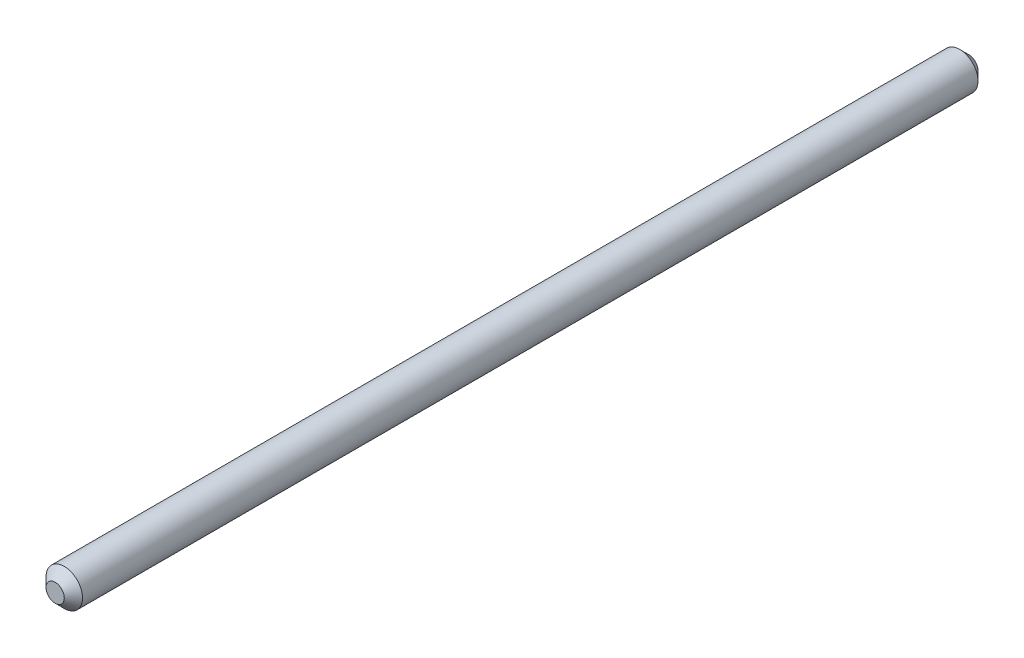
ISO-10303-21;
HEADER;
FILE_DESCRIPTION(('STEP AP214'),'2;1');
FILE_NAME('part.step','',(''),(''),'','','');
FILE_SCHEMA(('AUTOMOTIVE_DESIGN { 1 0 10303 214 1 1 1 1 }'));
ENDSEC;
DATA;
#1=APPLICATION_CONTEXT('core data for automotive mechanical design processes');
#2=APPLICATION_PROTOCOL_DEFINITION('international standard','automotive_design',2000,#1);
#3=PRODUCT_CONTEXT('',#1,'mechanical');
#4=PRODUCT('Part','Part','',(#3));
#5=PRODUCT_RELATED_PRODUCT_CATEGORY('part','',(#4));
#6=PRODUCT_DEFINITION_FORMATION('','',#4);
#7=PRODUCT_DEFINITION_CONTEXT('part definition',#1,'design');
#8=PRODUCT_DEFINITION('design','',#6,#7);
#9=PRODUCT_DEFINITION_SHAPE('','',#8);
#10=(LENGTH_UNIT() NAMED_UNIT(*) SI_UNIT(.MILLI.,.METRE.));
#11=(NAMED_UNIT(*) PLANE_ANGLE_UNIT() SI_UNIT($,.RADIAN.));
#12=(NAMED_UNIT(*) SI_UNIT($,.STERADIAN.) SOLID_ANGLE_UNIT());
#13=UNCERTAINTY_MEASURE_WITH_UNIT(LENGTH_MEASURE(1.E-05),#10,'distance_accuracy_value','');
#14=(GEOMETRIC_REPRESENTATION_CONTEXT(3) GLOBAL_UNCERTAINTY_ASSIGNED_CONTEXT((#13)) GLOBAL_UNIT_ASSIGNED_CONTEXT((#10,
#11,#12)) REPRESENTATION_CONTEXT('',''));
#15=CARTESIAN_POINT('',(0.,0.,0.));
#16=DIRECTION('',(0.,0.,1.));
#17=DIRECTION('',(1.,0.,0.));
#18=AXIS2_PLACEMENT_3D('',#15,#16,#17);
#19=CARTESIAN_POINT('',(0.,0.,-50.));
#20=DIRECTION('',(0.,0.,1.));
#21=DIRECTION('',(-1.,0.,0.));
#22=AXIS2_PLACEMENT_3D('',#19,#20,#21);
#23=CYLINDRICAL_SURFACE('',#22,1.);
#24=CARTESIAN_POINT('',(0.,0.,-0.499999999999994));
#25=DIRECTION('',(0.,0.,1.));
#26=DIRECTION('',(1.,0.,0.));
#27=AXIS2_PLACEMENT_3D('',#24,#25,#26);
#28=CIRCLE('',#27,1.);
#29=CARTESIAN_POINT('',(1.,0.,-0.499999999999994));
#30=VERTEX_POINT('',#29);
#31=EDGE_CURVE('E46',#30,#30,#28,.T.);
#32=ORIENTED_EDGE('',*,*,#31,.F.);
#33=EDGE_LOOP('',(#32));
#34=FACE_BOUND('',#33,.T.);
#35=CARTESIAN_POINT('',(0.,0.,-49.5));
#36=DIRECTION('',(0.,0.,1.));
#37=DIRECTION('',(1.,0.,0.));
#38=AXIS2_PLACEMENT_3D('',#35,#36,#37);
#39=CIRCLE('',#38,1.);
#40=CARTESIAN_POINT('',(1.,0.,-49.5));
#41=VERTEX_POINT('',#40);
#42=EDGE_CURVE('E50',#41,#41,#39,.F.);
#43=ORIENTED_EDGE('',*,*,#42,.F.);
#44=EDGE_LOOP('',(#43));
#45=FACE_BOUND('',#44,.T.);
#46=ADVANCED_FACE('F35',(#34,#45),#23,.T.);
#47=CARTESIAN_POINT('',(0.,0.,-50.));
#48=DIRECTION('',(0.,0.,-1.));
#49=DIRECTION('',(1.,0.,0.));
#50=AXIS2_PLACEMENT_3D('',#47,#48,#49);
#51=PLANE('',#50);
#52=CARTESIAN_POINT('',(0.,0.,-50.));
#53=DIRECTION('',(0.,0.,1.));
#54=DIRECTION('',(1.,0.,0.));
#55=AXIS2_PLACEMENT_3D('',#52,#53,#54);
#56=CIRCLE('',#55,0.5);
#57=CARTESIAN_POINT('',(0.5,0.,-50.));
#58=VERTEX_POINT('',#57);
#59=EDGE_CURVE('E10',#58,#58,#56,.T.);
#60=ORIENTED_EDGE('',*,*,#59,.F.);
#61=EDGE_LOOP('',(#60));
#62=FACE_BOUND('',#61,.T.);
#63=ADVANCED_FACE('F58',(#62),#51,.T.);
#64=CARTESIAN_POINT('',(0.,0.,0.));
#65=DIRECTION('',(0.,0.,-1.));
#66=DIRECTION('',(1.,0.,0.));
#67=AXIS2_PLACEMENT_3D('',#64,#65,#66);
#68=PLANE('',#67);
#69=CARTESIAN_POINT('',(0.,0.,0.));
#70=DIRECTION('',(0.,0.,1.));
#71=DIRECTION('',(1.,0.,0.));
#72=AXIS2_PLACEMENT_3D('',#69,#70,#71);
#73=CIRCLE('',#72,0.5);
#74=CARTESIAN_POINT('',(0.5,0.,0.));
#75=VERTEX_POINT('',#74);
#76=EDGE_CURVE('E42',#75,#75,#73,.F.);
#77=ORIENTED_EDGE('',*,*,#76,.F.);
#78=EDGE_LOOP('',(#77));
#79=FACE_BOUND('',#78,.T.);
#80=ADVANCED_FACE('F64',(#79),#68,.F.);
#81=CARTESIAN_POINT('',(0.,0.,-0.499999999999994));
#82=DIRECTION('',(0.,0.,-1.));
#83=DIRECTION('',(1.,0.,0.));
#84=AXIS2_PLACEMENT_3D('',#81,#82,#83);
#85=CONICAL_SURFACE('',#84,1.,0.785398163397454);
#86=ORIENTED_EDGE('',*,*,#76,.T.);
#87=EDGE_LOOP('',(#86));
#88=FACE_BOUND('',#87,.T.);
#89=ORIENTED_EDGE('',*,*,#31,.T.);
#90=EDGE_LOOP('',(#89));
#91=FACE_BOUND('',#90,.T.);
#92=ADVANCED_FACE('F69',(#88,#91),#85,.T.);
#93=CARTESIAN_POINT('',(0.,0.,-50.));
#94=DIRECTION('',(0.,0.,1.));
#95=DIRECTION('',(-1.,0.,0.));
#96=AXIS2_PLACEMENT_3D('',#93,#94,#95);
#97=CONICAL_SURFACE('',#96,0.5,0.785398163397454);
#98=ORIENTED_EDGE('',*,*,#42,.T.);
#99=EDGE_LOOP('',(#98));
#100=FACE_BOUND('',#99,.T.);
#101=ORIENTED_EDGE('',*,*,#59,.T.);
#102=EDGE_LOOP('',(#101));
#103=FACE_BOUND('',#102,.T.);
#104=ADVANCED_FACE('F37',(#100,#103),#97,.T.);
#105=CLOSED_SHELL('',(#46,#63,#80,#92,#104));
#106=MANIFOLD_SOLID_BREP('B2',#105);
#107=ADVANCED_BREP_SHAPE_REPRESENTATION('',(#18,#106),#14);
#108=SHAPE_DEFINITION_REPRESENTATION(#9,#107);
ENDSEC;
END-ISO-10303-21;
